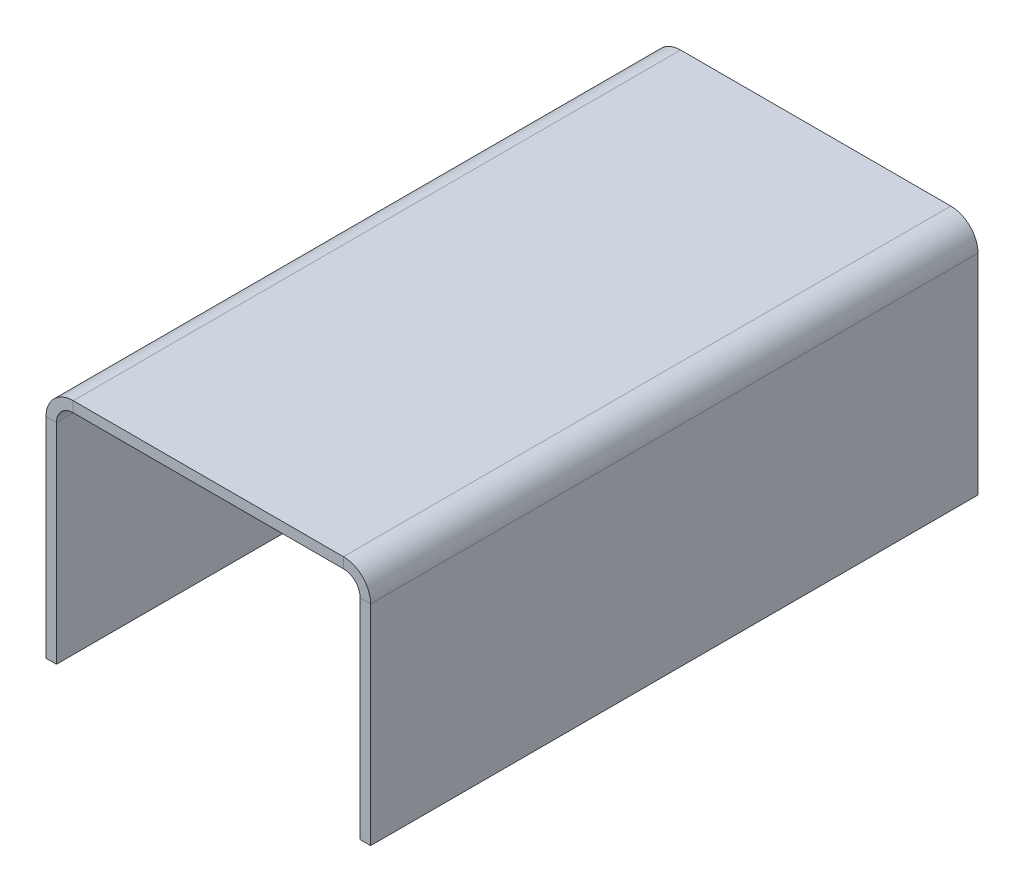
ISO-10303-21;
HEADER;
FILE_DESCRIPTION(('STEP AP214'),'2;1');
FILE_NAME('part.step','',(''),(''),'','','');
FILE_SCHEMA(('AUTOMOTIVE_DESIGN { 1 0 10303 214 1 1 1 1 }'));
ENDSEC;
DATA;
#1=APPLICATION_CONTEXT('core data for automotive mechanical design processes');
#2=APPLICATION_PROTOCOL_DEFINITION('international standard','automotive_design',2000,#1);
#3=PRODUCT_CONTEXT('',#1,'mechanical');
#4=PRODUCT('Part','Part','',(#3));
#5=PRODUCT_RELATED_PRODUCT_CATEGORY('part','',(#4));
#6=PRODUCT_DEFINITION_FORMATION('','',#4);
#7=PRODUCT_DEFINITION_CONTEXT('part definition',#1,'design');
#8=PRODUCT_DEFINITION('design','',#6,#7);
#9=PRODUCT_DEFINITION_SHAPE('','',#8);
#10=(LENGTH_UNIT() NAMED_UNIT(*) SI_UNIT(.MILLI.,.METRE.));
#11=(NAMED_UNIT(*) PLANE_ANGLE_UNIT() SI_UNIT($,.RADIAN.));
#12=(NAMED_UNIT(*) SI_UNIT($,.STERADIAN.) SOLID_ANGLE_UNIT());
#13=UNCERTAINTY_MEASURE_WITH_UNIT(LENGTH_MEASURE(1.E-05),#10,'distance_accuracy_value','');
#14=(GEOMETRIC_REPRESENTATION_CONTEXT(3) GLOBAL_UNCERTAINTY_ASSIGNED_CONTEXT((#13)) GLOBAL_UNIT_ASSIGNED_CONTEXT((#10,
#11,#12)) REPRESENTATION_CONTEXT('',''));
#15=CARTESIAN_POINT('',(0.,0.,0.));
#16=DIRECTION('',(0.,0.,1.));
#17=DIRECTION('',(1.,0.,0.));
#18=AXIS2_PLACEMENT_3D('',#15,#16,#17);
#19=CARTESIAN_POINT('',(0.,-5.,0.));
#20=DIRECTION('',(0.,-1.,0.));
#21=DIRECTION('',(0.,0.,-1.));
#22=AXIS2_PLACEMENT_3D('',#19,#20,#21);
#23=PLANE('',#22);
#24=DIRECTION('',(1.,0.,0.));
#25=VECTOR('',#24,1.);
#26=CARTESIAN_POINT('',(-77.5,-5.,145.));
#27=LINE('',#26,#25);
#28=CARTESIAN_POINT('',(-64.5000000000001,-5.,145.));
#29=VERTEX_POINT('',#28);
#30=CARTESIAN_POINT('',(64.5,-5.,145.));
#31=VERTEX_POINT('',#30);
#32=EDGE_CURVE('E13',#29,#31,#27,.T.);
#33=ORIENTED_EDGE('',*,*,#32,.F.);
#34=DIRECTION('',(0.,0.,-1.));
#35=VECTOR('',#34,1.);
#36=CARTESIAN_POINT('',(-64.5000000000001,-5.,-145.));
#37=LINE('',#36,#35);
#38=CARTESIAN_POINT('',(-64.5000000000001,-5.,-145.));
#39=VERTEX_POINT('',#38);
#40=EDGE_CURVE('E220',#39,#29,#37,.F.);
#41=ORIENTED_EDGE('',*,*,#40,.F.);
#42=DIRECTION('',(-1.,0.,0.));
#43=VECTOR('',#42,1.);
#44=CARTESIAN_POINT('',(-77.5,-5.,-145.));
#45=LINE('',#44,#43);
#46=CARTESIAN_POINT('',(64.5,-5.,-145.));
#47=VERTEX_POINT('',#46);
#48=EDGE_CURVE('E84',#47,#39,#45,.T.);
#49=ORIENTED_EDGE('',*,*,#48,.F.);
#50=DIRECTION('',(0.,0.,1.));
#51=VECTOR('',#50,1.);
#52=CARTESIAN_POINT('',(64.5,-5.,145.));
#53=LINE('',#52,#51);
#54=EDGE_CURVE('E274',#31,#47,#53,.F.);
#55=ORIENTED_EDGE('',*,*,#54,.F.);
#56=EDGE_LOOP('',(#33,#41,#49,#55));
#57=FACE_BOUND('',#56,.T.);
#58=ADVANCED_FACE('F75',(#57),#23,.T.);
#59=CARTESIAN_POINT('',(0.,0.,0.));
#60=DIRECTION('',(0.,-1.,0.));
#61=DIRECTION('',(0.,0.,-1.));
#62=AXIS2_PLACEMENT_3D('',#59,#60,#61);
#63=PLANE('',#62);
#64=DIRECTION('',(0.,0.,-1.));
#65=VECTOR('',#64,1.);
#66=CARTESIAN_POINT('',(-64.5000000000001,0.,-145.));
#67=LINE('',#66,#65);
#68=CARTESIAN_POINT('',(-64.5000000000001,0.,-145.));
#69=VERTEX_POINT('',#68);
#70=CARTESIAN_POINT('',(-64.5000000000001,0.,145.));
#71=VERTEX_POINT('',#70);
#72=EDGE_CURVE('E208',#69,#71,#67,.F.);
#73=ORIENTED_EDGE('',*,*,#72,.T.);
#74=DIRECTION('',(1.,0.,0.));
#75=VECTOR('',#74,1.);
#76=CARTESIAN_POINT('',(-77.5,0.,145.));
#77=LINE('',#76,#75);
#78=CARTESIAN_POINT('',(64.5,0.,145.));
#79=VERTEX_POINT('',#78);
#80=EDGE_CURVE('E79',#71,#79,#77,.T.);
#81=ORIENTED_EDGE('',*,*,#80,.T.);
#82=DIRECTION('',(0.,0.,1.));
#83=VECTOR('',#82,1.);
#84=CARTESIAN_POINT('',(64.5,0.,145.));
#85=LINE('',#84,#83);
#86=CARTESIAN_POINT('',(64.5,0.,-145.));
#87=VERTEX_POINT('',#86);
#88=EDGE_CURVE('E262',#79,#87,#85,.F.);
#89=ORIENTED_EDGE('',*,*,#88,.T.);
#90=DIRECTION('',(-1.,0.,0.));
#91=VECTOR('',#90,1.);
#92=CARTESIAN_POINT('',(-77.5,0.,-145.));
#93=LINE('',#92,#91);
#94=EDGE_CURVE('E280',#87,#69,#93,.T.);
#95=ORIENTED_EDGE('',*,*,#94,.T.);
#96=EDGE_LOOP('',(#73,#81,#89,#95));
#97=FACE_BOUND('',#96,.T.);
#98=ADVANCED_FACE('F286',(#97),#63,.F.);
#99=CARTESIAN_POINT('',(-77.5,-5.,-145.));
#100=DIRECTION('',(0.,0.,-1.));
#101=DIRECTION('',(-1.,0.,0.));
#102=AXIS2_PLACEMENT_3D('',#99,#100,#101);
#103=PLANE('',#102);
#104=ORIENTED_EDGE('',*,*,#48,.T.);
#105=DIRECTION('',(0.,1.,0.));
#106=VECTOR('',#105,1.);
#107=CARTESIAN_POINT('',(-64.5000000000001,-5.,-145.));
#108=LINE('',#107,#106);
#109=EDGE_CURVE('E214',#39,#69,#108,.T.);
#110=ORIENTED_EDGE('',*,*,#109,.T.);
#111=ORIENTED_EDGE('',*,*,#94,.F.);
#112=DIRECTION('',(0.,1.,0.));
#113=VECTOR('',#112,1.);
#114=CARTESIAN_POINT('',(64.5,-5.,-145.));
#115=LINE('',#114,#113);
#116=EDGE_CURVE('E92',#47,#87,#115,.T.);
#117=ORIENTED_EDGE('',*,*,#116,.F.);
#118=EDGE_LOOP('',(#104,#110,#111,#117));
#119=FACE_BOUND('',#118,.T.);
#120=ADVANCED_FACE('F77',(#119),#103,.T.);
#121=CARTESIAN_POINT('',(-77.5,-5.,145.));
#122=DIRECTION('',(0.,0.,1.));
#123=DIRECTION('',(1.,0.,0.));
#124=AXIS2_PLACEMENT_3D('',#121,#122,#123);
#125=PLANE('',#124);
#126=DIRECTION('',(0.,1.,0.));
#127=VECTOR('',#126,1.);
#128=CARTESIAN_POINT('',(-64.5000000000001,-5.,145.));
#129=LINE('',#128,#127);
#130=EDGE_CURVE('E226',#29,#71,#129,.T.);
#131=ORIENTED_EDGE('',*,*,#130,.F.);
#132=ORIENTED_EDGE('',*,*,#32,.T.);
#133=DIRECTION('',(0.,1.,0.));
#134=VECTOR('',#133,1.);
#135=CARTESIAN_POINT('',(64.5,-5.,145.));
#136=LINE('',#135,#134);
#137=EDGE_CURVE('E268',#31,#79,#136,.T.);
#138=ORIENTED_EDGE('',*,*,#137,.T.);
#139=ORIENTED_EDGE('',*,*,#80,.F.);
#140=EDGE_LOOP('',(#131,#132,#138,#139));
#141=FACE_BOUND('',#140,.T.);
#142=ADVANCED_FACE('F340',(#141),#125,.T.);
#143=CARTESIAN_POINT('',(64.5,-13.,-145.));
#144=DIRECTION('',(0.,0.,-1.));
#145=DIRECTION('',(-1.,0.,0.));
#146=AXIS2_PLACEMENT_3D('',#143,#144,#145);
#147=PLANE('',#146);
#148=DIRECTION('',(-1.,0.,0.));
#149=VECTOR('',#148,1.);
#150=CARTESIAN_POINT('',(77.5,-13.,-145.));
#151=LINE('',#150,#149);
#152=CARTESIAN_POINT('',(72.5,-13.,-145.));
#153=VERTEX_POINT('',#152);
#154=CARTESIAN_POINT('',(77.5,-13.,-145.));
#155=VERTEX_POINT('',#154);
#156=EDGE_CURVE('E229',#153,#155,#151,.F.);
#157=ORIENTED_EDGE('',*,*,#156,.F.);
#158=CARTESIAN_POINT('',(64.5,-13.,-145.));
#159=DIRECTION('',(0.,0.,1.));
#160=DIRECTION('',(1.,0.,0.));
#161=AXIS2_PLACEMENT_3D('',#158,#159,#160);
#162=CIRCLE('',#161,7.99999999999999);
#163=EDGE_CURVE('E271',#47,#153,#162,.F.);
#164=ORIENTED_EDGE('',*,*,#163,.F.);
#165=ORIENTED_EDGE('',*,*,#116,.T.);
#166=CARTESIAN_POINT('',(64.5,-13.,-145.));
#167=DIRECTION('',(0.,0.,1.));
#168=DIRECTION('',(1.,0.,0.));
#169=AXIS2_PLACEMENT_3D('',#166,#167,#168);
#170=CIRCLE('',#169,13.);
#171=EDGE_CURVE('E264',#87,#155,#170,.F.);
#172=ORIENTED_EDGE('',*,*,#171,.T.);
#173=EDGE_LOOP('',(#157,#164,#165,#172));
#174=FACE_BOUND('',#173,.T.);
#175=ADVANCED_FACE('F315',(#174),#147,.T.);
#176=CARTESIAN_POINT('',(64.5,-13.,145.));
#177=DIRECTION('',(0.,0.,-1.));
#178=DIRECTION('',(-1.,0.,0.));
#179=AXIS2_PLACEMENT_3D('',#176,#177,#178);
#180=PLANE('',#179);
#181=CARTESIAN_POINT('',(64.5,-13.,145.));
#182=DIRECTION('',(0.,0.,1.));
#183=DIRECTION('',(1.,0.,0.));
#184=AXIS2_PLACEMENT_3D('',#181,#182,#183);
#185=CIRCLE('',#184,7.99999999999999);
#186=CARTESIAN_POINT('',(72.5,-13.,145.));
#187=VERTEX_POINT('',#186);
#188=EDGE_CURVE('E235',#187,#31,#185,.T.);
#189=ORIENTED_EDGE('',*,*,#188,.F.);
#190=DIRECTION('',(-1.,0.,0.));
#191=VECTOR('',#190,1.);
#192=CARTESIAN_POINT('',(72.5,-13.,145.));
#193=LINE('',#192,#191);
#194=CARTESIAN_POINT('',(77.5,-13.,145.));
#195=VERTEX_POINT('',#194);
#196=EDGE_CURVE('E255',#187,#195,#193,.F.);
#197=ORIENTED_EDGE('',*,*,#196,.T.);
#198=CARTESIAN_POINT('',(64.5,-13.,145.));
#199=DIRECTION('',(0.,0.,1.));
#200=DIRECTION('',(1.,0.,0.));
#201=AXIS2_PLACEMENT_3D('',#198,#199,#200);
#202=CIRCLE('',#201,13.);
#203=EDGE_CURVE('E265',#195,#79,#202,.T.);
#204=ORIENTED_EDGE('',*,*,#203,.T.);
#205=ORIENTED_EDGE('',*,*,#137,.F.);
#206=EDGE_LOOP('',(#189,#197,#204,#205));
#207=FACE_BOUND('',#206,.T.);
#208=ADVANCED_FACE('F294',(#207),#180,.F.);
#209=CARTESIAN_POINT('',(64.5,-13.,145.));
#210=DIRECTION('',(0.,0.,1.));
#211=DIRECTION('',(1.,0.,0.));
#212=AXIS2_PLACEMENT_3D('',#209,#210,#211);
#213=CYLINDRICAL_SURFACE('',#212,13.);
#214=ORIENTED_EDGE('',*,*,#88,.F.);
#215=ORIENTED_EDGE('',*,*,#203,.F.);
#216=DIRECTION('',(0.,0.,1.));
#217=VECTOR('',#216,1.);
#218=CARTESIAN_POINT('',(77.5,-13.,-145.));
#219=LINE('',#218,#217);
#220=EDGE_CURVE('E253',#195,#155,#219,.F.);
#221=ORIENTED_EDGE('',*,*,#220,.T.);
#222=ORIENTED_EDGE('',*,*,#171,.F.);
#223=EDGE_LOOP('',(#214,#215,#221,#222));
#224=FACE_BOUND('',#223,.T.);
#225=ADVANCED_FACE('F290',(#224),#213,.T.);
#226=CARTESIAN_POINT('',(64.5,-13.,145.));
#227=DIRECTION('',(0.,0.,1.));
#228=DIRECTION('',(1.,0.,0.));
#229=AXIS2_PLACEMENT_3D('',#226,#227,#228);
#230=CYLINDRICAL_SURFACE('',#229,7.99999999999999);
#231=ORIENTED_EDGE('',*,*,#54,.T.);
#232=ORIENTED_EDGE('',*,*,#163,.T.);
#233=DIRECTION('',(0.,0.,1.));
#234=VECTOR('',#233,1.);
#235=CARTESIAN_POINT('',(72.5,-13.,-145.));
#236=LINE('',#235,#234);
#237=EDGE_CURVE('E258',#153,#187,#236,.T.);
#238=ORIENTED_EDGE('',*,*,#237,.T.);
#239=ORIENTED_EDGE('',*,*,#188,.T.);
#240=EDGE_LOOP('',(#231,#232,#238,#239));
#241=FACE_BOUND('',#240,.T.);
#242=ADVANCED_FACE('F318',(#241),#230,.F.);
#243=CARTESIAN_POINT('',(77.5000000000003,-113.,145.));
#244=DIRECTION('',(0.,0.,-1.));
#245=DIRECTION('',(-1.,0.,0.));
#246=AXIS2_PLACEMENT_3D('',#243,#244,#245);
#247=PLANE('',#246);
#248=ORIENTED_EDGE('',*,*,#196,.F.);
#249=DIRECTION('',(0.,1.,0.));
#250=VECTOR('',#249,1.);
#251=CARTESIAN_POINT('',(72.5000000000003,-113.,145.));
#252=LINE('',#251,#250);
#253=CARTESIAN_POINT('',(72.5000000000003,-113.,145.));
#254=VERTEX_POINT('',#253);
#255=EDGE_CURVE('E251',#187,#254,#252,.F.);
#256=ORIENTED_EDGE('',*,*,#255,.T.);
#257=DIRECTION('',(-1.,0.,0.));
#258=VECTOR('',#257,1.);
#259=CARTESIAN_POINT('',(77.5000000000003,-113.,145.));
#260=LINE('',#259,#258);
#261=CARTESIAN_POINT('',(77.5000000000003,-113.,145.));
#262=VERTEX_POINT('',#261);
#263=EDGE_CURVE('E232',#262,#254,#260,.T.);
#264=ORIENTED_EDGE('',*,*,#263,.F.);
#265=DIRECTION('',(0.,-1.,0.));
#266=VECTOR('',#265,1.);
#267=CARTESIAN_POINT('',(77.5,2.86339545470621E-13,145.));
#268=LINE('',#267,#266);
#269=EDGE_CURVE('E244',#195,#262,#268,.T.);
#270=ORIENTED_EDGE('',*,*,#269,.F.);
#271=EDGE_LOOP('',(#248,#256,#264,#270));
#272=FACE_BOUND('',#271,.T.);
#273=ADVANCED_FACE('F305',(#272),#247,.F.);
#274=CARTESIAN_POINT('',(77.5,-4.99999999999998,-145.));
#275=DIRECTION('',(0.,0.,1.));
#276=DIRECTION('',(1.,0.,0.));
#277=AXIS2_PLACEMENT_3D('',#274,#275,#276);
#278=PLANE('',#277);
#279=ORIENTED_EDGE('',*,*,#156,.T.);
#280=DIRECTION('',(0.,1.,0.));
#281=VECTOR('',#280,1.);
#282=CARTESIAN_POINT('',(77.5,2.86339545470621E-13,-145.));
#283=LINE('',#282,#281);
#284=CARTESIAN_POINT('',(77.5000000000003,-113.,-145.));
#285=VERTEX_POINT('',#284);
#286=EDGE_CURVE('E239',#285,#155,#283,.T.);
#287=ORIENTED_EDGE('',*,*,#286,.F.);
#288=DIRECTION('',(-1.,0.,0.));
#289=VECTOR('',#288,1.);
#290=CARTESIAN_POINT('',(77.5000000000003,-113.,-145.));
#291=LINE('',#290,#289);
#292=CARTESIAN_POINT('',(72.5000000000003,-113.,-145.));
#293=VERTEX_POINT('',#292);
#294=EDGE_CURVE('E236',#285,#293,#291,.T.);
#295=ORIENTED_EDGE('',*,*,#294,.T.);
#296=DIRECTION('',(0.,-1.,0.));
#297=VECTOR('',#296,1.);
#298=CARTESIAN_POINT('',(72.5,-5.,-145.));
#299=LINE('',#298,#297);
#300=EDGE_CURVE('E246',#293,#153,#299,.F.);
#301=ORIENTED_EDGE('',*,*,#300,.T.);
#302=EDGE_LOOP('',(#279,#287,#295,#301));
#303=FACE_BOUND('',#302,.T.);
#304=ADVANCED_FACE('F312',(#303),#278,.F.);
#305=CARTESIAN_POINT('',(77.5,2.86339545470621E-13,0.));
#306=DIRECTION('',(-1.,0.,0.));
#307=DIRECTION('',(0.,-1.,0.));
#308=AXIS2_PLACEMENT_3D('',#305,#306,#307);
#309=PLANE('',#308);
#310=ORIENTED_EDGE('',*,*,#220,.F.);
#311=ORIENTED_EDGE('',*,*,#269,.T.);
#312=DIRECTION('',(0.,0.,-1.));
#313=VECTOR('',#312,1.);
#314=CARTESIAN_POINT('',(77.5000000000003,-113.,0.));
#315=LINE('',#314,#313);
#316=EDGE_CURVE('E242',#262,#285,#315,.T.);
#317=ORIENTED_EDGE('',*,*,#316,.T.);
#318=ORIENTED_EDGE('',*,*,#286,.T.);
#319=EDGE_LOOP('',(#310,#311,#317,#318));
#320=FACE_BOUND('',#319,.T.);
#321=ADVANCED_FACE('F301',(#320),#309,.F.);
#322=CARTESIAN_POINT('',(72.5,2.68882138776405E-13,0.));
#323=DIRECTION('',(-1.,0.,0.));
#324=DIRECTION('',(0.,-1.,0.));
#325=AXIS2_PLACEMENT_3D('',#322,#323,#324);
#326=PLANE('',#325);
#327=ORIENTED_EDGE('',*,*,#255,.F.);
#328=ORIENTED_EDGE('',*,*,#237,.F.);
#329=ORIENTED_EDGE('',*,*,#300,.F.);
#330=DIRECTION('',(0.,0.,1.));
#331=VECTOR('',#330,1.);
#332=CARTESIAN_POINT('',(72.5000000000003,-113.,-145.));
#333=LINE('',#332,#331);
#334=EDGE_CURVE('E249',#254,#293,#333,.F.);
#335=ORIENTED_EDGE('',*,*,#334,.F.);
#336=EDGE_LOOP('',(#327,#328,#329,#335));
#337=FACE_BOUND('',#336,.T.);
#338=ADVANCED_FACE('F320',(#337),#326,.T.);
#339=CARTESIAN_POINT('',(77.5000000000003,-113.,-145.));
#340=DIRECTION('',(0.,1.,0.));
#341=DIRECTION('',(-1.,0.,0.));
#342=AXIS2_PLACEMENT_3D('',#339,#340,#341);
#343=PLANE('',#342);
#344=ORIENTED_EDGE('',*,*,#334,.T.);
#345=ORIENTED_EDGE('',*,*,#294,.F.);
#346=ORIENTED_EDGE('',*,*,#316,.F.);
#347=ORIENTED_EDGE('',*,*,#263,.T.);
#348=EDGE_LOOP('',(#344,#345,#346,#347));
#349=FACE_BOUND('',#348,.T.);
#350=ADVANCED_FACE('F308',(#349),#343,.F.);
#351=CARTESIAN_POINT('',(-64.5000000000001,-13.,145.));
#352=DIRECTION('',(0.,0.,1.));
#353=DIRECTION('',(1.,0.,0.));
#354=AXIS2_PLACEMENT_3D('',#351,#352,#353);
#355=PLANE('',#354);
#356=DIRECTION('',(1.,0.,0.));
#357=VECTOR('',#356,1.);
#358=CARTESIAN_POINT('',(-77.5000000000001,-13.,145.));
#359=LINE('',#358,#357);
#360=CARTESIAN_POINT('',(-72.5000000000001,-13.,145.));
#361=VERTEX_POINT('',#360);
#362=CARTESIAN_POINT('',(-77.5000000000001,-13.,145.));
#363=VERTEX_POINT('',#362);
#364=EDGE_CURVE('E190',#361,#363,#359,.F.);
#365=ORIENTED_EDGE('',*,*,#364,.F.);
#366=CARTESIAN_POINT('',(-64.5000000000001,-13.,145.));
#367=DIRECTION('',(0.,0.,-1.));
#368=DIRECTION('',(-1.,0.,0.));
#369=AXIS2_PLACEMENT_3D('',#366,#367,#368);
#370=CIRCLE('',#369,7.99999999999999);
#371=EDGE_CURVE('E217',#29,#361,#370,.F.);
#372=ORIENTED_EDGE('',*,*,#371,.F.);
#373=ORIENTED_EDGE('',*,*,#130,.T.);
#374=CARTESIAN_POINT('',(-64.5000000000001,-13.,145.));
#375=DIRECTION('',(0.,0.,-1.));
#376=DIRECTION('',(-1.,0.,0.));
#377=AXIS2_PLACEMENT_3D('',#374,#375,#376);
#378=CIRCLE('',#377,13.);
#379=EDGE_CURVE('E210',#71,#363,#378,.F.);
#380=ORIENTED_EDGE('',*,*,#379,.T.);
#381=EDGE_LOOP('',(#365,#372,#373,#380));
#382=FACE_BOUND('',#381,.T.);
#383=ADVANCED_FACE('F327',(#382),#355,.T.);
#384=CARTESIAN_POINT('',(-64.5000000000001,-13.,-145.));
#385=DIRECTION('',(0.,0.,1.));
#386=DIRECTION('',(1.,0.,0.));
#387=AXIS2_PLACEMENT_3D('',#384,#385,#386);
#388=PLANE('',#387);
#389=CARTESIAN_POINT('',(-64.5000000000001,-13.,-145.));
#390=DIRECTION('',(0.,0.,-1.));
#391=DIRECTION('',(-1.,0.,0.));
#392=AXIS2_PLACEMENT_3D('',#389,#390,#391);
#393=CIRCLE('',#392,7.99999999999999);
#394=CARTESIAN_POINT('',(-72.5000000000001,-13.,-145.));
#395=VERTEX_POINT('',#394);
#396=EDGE_CURVE('E223',#395,#39,#393,.T.);
#397=ORIENTED_EDGE('',*,*,#396,.F.);
#398=DIRECTION('',(1.,0.,0.));
#399=VECTOR('',#398,1.);
#400=CARTESIAN_POINT('',(-72.5000000000001,-13.,-145.));
#401=LINE('',#400,#399);
#402=CARTESIAN_POINT('',(-77.5000000000001,-13.,-145.));
#403=VERTEX_POINT('',#402);
#404=EDGE_CURVE('E202',#395,#403,#401,.F.);
#405=ORIENTED_EDGE('',*,*,#404,.T.);
#406=CARTESIAN_POINT('',(-64.5000000000001,-13.,-145.));
#407=DIRECTION('',(0.,0.,-1.));
#408=DIRECTION('',(-1.,0.,0.));
#409=AXIS2_PLACEMENT_3D('',#406,#407,#408);
#410=CIRCLE('',#409,13.);
#411=EDGE_CURVE('E211',#403,#69,#410,.T.);
#412=ORIENTED_EDGE('',*,*,#411,.T.);
#413=ORIENTED_EDGE('',*,*,#109,.F.);
#414=EDGE_LOOP('',(#397,#405,#412,#413));
#415=FACE_BOUND('',#414,.T.);
#416=ADVANCED_FACE('F363',(#415),#388,.F.);
#417=CARTESIAN_POINT('',(-64.5000000000001,-13.,-145.));
#418=DIRECTION('',(0.,0.,-1.));
#419=DIRECTION('',(-1.,0.,0.));
#420=AXIS2_PLACEMENT_3D('',#417,#418,#419);
#421=CYLINDRICAL_SURFACE('',#420,13.);
#422=ORIENTED_EDGE('',*,*,#72,.F.);
#423=ORIENTED_EDGE('',*,*,#411,.F.);
#424=DIRECTION('',(0.,0.,-1.));
#425=VECTOR('',#424,1.);
#426=CARTESIAN_POINT('',(-77.5000000000001,-13.,145.));
#427=LINE('',#426,#425);
#428=EDGE_CURVE('E200',#403,#363,#427,.F.);
#429=ORIENTED_EDGE('',*,*,#428,.T.);
#430=ORIENTED_EDGE('',*,*,#379,.F.);
#431=EDGE_LOOP('',(#422,#423,#429,#430));
#432=FACE_BOUND('',#431,.T.);
#433=ADVANCED_FACE('F354',(#432),#421,.T.);
#434=CARTESIAN_POINT('',(-64.5000000000001,-13.,-145.));
#435=DIRECTION('',(0.,0.,-1.));
#436=DIRECTION('',(-1.,0.,0.));
#437=AXIS2_PLACEMENT_3D('',#434,#435,#436);
#438=CYLINDRICAL_SURFACE('',#437,7.99999999999999);
#439=ORIENTED_EDGE('',*,*,#40,.T.);
#440=ORIENTED_EDGE('',*,*,#371,.T.);
#441=DIRECTION('',(0.,0.,-1.));
#442=VECTOR('',#441,1.);
#443=CARTESIAN_POINT('',(-72.5000000000001,-13.,145.));
#444=LINE('',#443,#442);
#445=EDGE_CURVE('E205',#361,#395,#444,.T.);
#446=ORIENTED_EDGE('',*,*,#445,.T.);
#447=ORIENTED_EDGE('',*,*,#396,.T.);
#448=EDGE_LOOP('',(#439,#440,#446,#447));
#449=FACE_BOUND('',#448,.T.);
#450=ADVANCED_FACE('F350',(#449),#438,.F.);
#451=CARTESIAN_POINT('',(-77.5000000000004,-113.,-145.));
#452=DIRECTION('',(0.,0.,1.));
#453=DIRECTION('',(1.,0.,0.));
#454=AXIS2_PLACEMENT_3D('',#451,#452,#453);
#455=PLANE('',#454);
#456=ORIENTED_EDGE('',*,*,#404,.F.);
#457=DIRECTION('',(0.,1.,0.));
#458=VECTOR('',#457,1.);
#459=CARTESIAN_POINT('',(-72.5000000000004,-113.,-145.));
#460=LINE('',#459,#458);
#461=CARTESIAN_POINT('',(-72.5000000000004,-113.,-145.));
#462=VERTEX_POINT('',#461);
#463=EDGE_CURVE('E198',#395,#462,#460,.F.);
#464=ORIENTED_EDGE('',*,*,#463,.T.);
#465=DIRECTION('',(1.,0.,0.));
#466=VECTOR('',#465,1.);
#467=CARTESIAN_POINT('',(-77.5000000000004,-113.,-145.));
#468=LINE('',#467,#466);
#469=CARTESIAN_POINT('',(-77.5000000000004,-113.,-145.));
#470=VERTEX_POINT('',#469);
#471=EDGE_CURVE('E186',#470,#462,#468,.T.);
#472=ORIENTED_EDGE('',*,*,#471,.F.);
#473=DIRECTION('',(0.,-1.,0.));
#474=VECTOR('',#473,1.);
#475=CARTESIAN_POINT('',(-77.5,2.86339545470621E-13,-145.));
#476=LINE('',#475,#474);
#477=EDGE_CURVE('E173',#403,#470,#476,.T.);
#478=ORIENTED_EDGE('',*,*,#477,.F.);
#479=EDGE_LOOP('',(#456,#464,#472,#478));
#480=FACE_BOUND('',#479,.T.);
#481=ADVANCED_FACE('F357',(#480),#455,.F.);
#482=CARTESIAN_POINT('',(-77.5,-4.99999999999998,145.));
#483=DIRECTION('',(0.,0.,-1.));
#484=DIRECTION('',(-1.,0.,0.));
#485=AXIS2_PLACEMENT_3D('',#482,#483,#484);
#486=PLANE('',#485);
#487=ORIENTED_EDGE('',*,*,#364,.T.);
#488=DIRECTION('',(0.,1.,0.));
#489=VECTOR('',#488,1.);
#490=CARTESIAN_POINT('',(-77.5,2.86339545470621E-13,145.));
#491=LINE('',#490,#489);
#492=CARTESIAN_POINT('',(-77.5000000000004,-113.,145.));
#493=VERTEX_POINT('',#492);
#494=EDGE_CURVE('E171',#493,#363,#491,.T.);
#495=ORIENTED_EDGE('',*,*,#494,.F.);
#496=DIRECTION('',(1.,0.,0.));
#497=VECTOR('',#496,1.);
#498=CARTESIAN_POINT('',(-77.5000000000004,-113.,145.));
#499=LINE('',#498,#497);
#500=CARTESIAN_POINT('',(-72.5000000000004,-113.,145.));
#501=VERTEX_POINT('',#500);
#502=EDGE_CURVE('E179',#493,#501,#499,.T.);
#503=ORIENTED_EDGE('',*,*,#502,.T.);
#504=DIRECTION('',(0.,-1.,0.));
#505=VECTOR('',#504,1.);
#506=CARTESIAN_POINT('',(-72.5,-5.,145.));
#507=LINE('',#506,#505);
#508=EDGE_CURVE('E195',#501,#361,#507,.F.);
#509=ORIENTED_EDGE('',*,*,#508,.T.);
#510=EDGE_LOOP('',(#487,#495,#503,#509));
#511=FACE_BOUND('',#510,.T.);
#512=ADVANCED_FACE('F189',(#511),#486,.F.);
#513=CARTESIAN_POINT('',(-77.5,2.86339545470621E-13,0.));
#514=DIRECTION('',(1.,0.,0.));
#515=DIRECTION('',(0.,1.,0.));
#516=AXIS2_PLACEMENT_3D('',#513,#514,#515);
#517=PLANE('',#516);
#518=ORIENTED_EDGE('',*,*,#428,.F.);
#519=ORIENTED_EDGE('',*,*,#477,.T.);
#520=DIRECTION('',(0.,0.,1.));
#521=VECTOR('',#520,1.);
#522=CARTESIAN_POINT('',(-77.5000000000004,-113.,0.));
#523=LINE('',#522,#521);
#524=EDGE_CURVE('E166',#470,#493,#523,.T.);
#525=ORIENTED_EDGE('',*,*,#524,.T.);
#526=ORIENTED_EDGE('',*,*,#494,.T.);
#527=EDGE_LOOP('',(#518,#519,#525,#526));
#528=FACE_BOUND('',#527,.T.);
#529=ADVANCED_FACE('F169',(#528),#517,.F.);
#530=CARTESIAN_POINT('',(-72.5,2.68882138776405E-13,0.));
#531=DIRECTION('',(1.,0.,0.));
#532=DIRECTION('',(0.,1.,0.));
#533=AXIS2_PLACEMENT_3D('',#530,#531,#532);
#534=PLANE('',#533);
#535=ORIENTED_EDGE('',*,*,#463,.F.);
#536=ORIENTED_EDGE('',*,*,#445,.F.);
#537=ORIENTED_EDGE('',*,*,#508,.F.);
#538=DIRECTION('',(0.,0.,-1.));
#539=VECTOR('',#538,1.);
#540=CARTESIAN_POINT('',(-72.5000000000004,-113.,145.));
#541=LINE('',#540,#539);
#542=EDGE_CURVE('E182',#462,#501,#541,.F.);
#543=ORIENTED_EDGE('',*,*,#542,.F.);
#544=EDGE_LOOP('',(#535,#536,#537,#543));
#545=FACE_BOUND('',#544,.T.);
#546=ADVANCED_FACE('F360',(#545),#534,.T.);
#547=CARTESIAN_POINT('',(-77.5000000000004,-113.,145.));
#548=DIRECTION('',(0.,1.,0.));
#549=DIRECTION('',(-1.,0.,0.));
#550=AXIS2_PLACEMENT_3D('',#547,#548,#549);
#551=PLANE('',#550);
#552=ORIENTED_EDGE('',*,*,#542,.T.);
#553=ORIENTED_EDGE('',*,*,#502,.F.);
#554=ORIENTED_EDGE('',*,*,#524,.F.);
#555=ORIENTED_EDGE('',*,*,#471,.T.);
#556=EDGE_LOOP('',(#552,#553,#554,#555));
#557=FACE_BOUND('',#556,.T.);
#558=ADVANCED_FACE('F180',(#557),#551,.F.);
#559=CLOSED_SHELL('',(#58,#98,#120,#142,#175,#208,#225,#242,#273,#304,#321,#338,#350,#383,#416,
#433,#450,#481,#512,#529,#546,#558));
#560=MANIFOLD_SOLID_BREP('B2',#559);
#561=ADVANCED_BREP_SHAPE_REPRESENTATION('',(#18,#560),#14);
#562=SHAPE_DEFINITION_REPRESENTATION(#9,#561);
ENDSEC;
END-ISO-10303-21;
